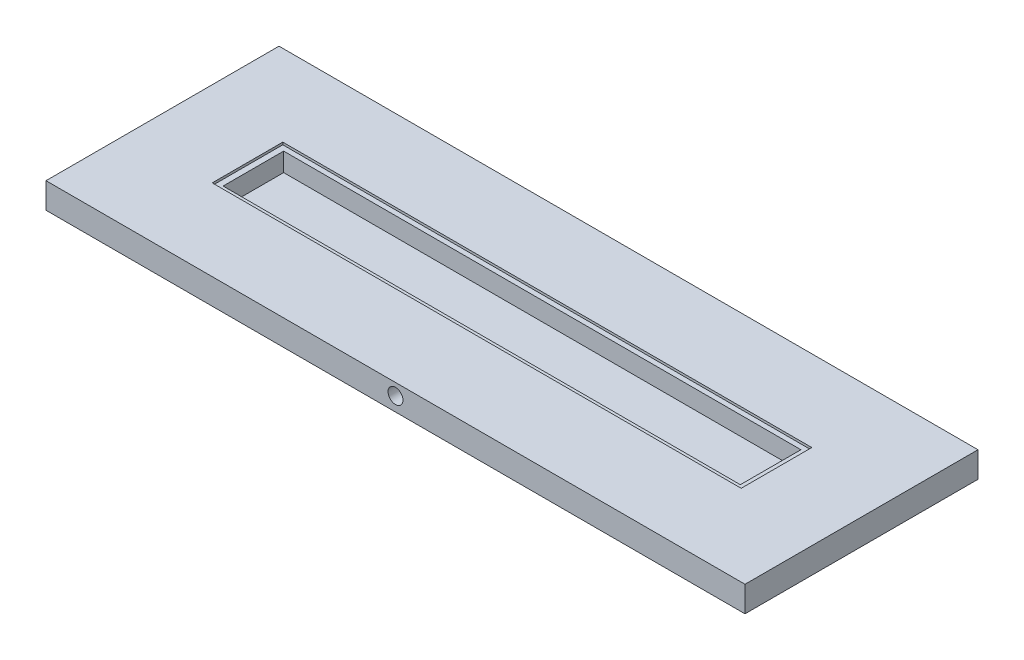
ISO-10303-21;
HEADER;
FILE_DESCRIPTION(('STEP AP214'),'2;1');
FILE_NAME('part.step','',(''),(''),'','','');
FILE_SCHEMA(('AUTOMOTIVE_DESIGN { 1 0 10303 214 1 1 1 1 }'));
ENDSEC;
DATA;
#1=APPLICATION_CONTEXT('core data for automotive mechanical design processes');
#2=APPLICATION_PROTOCOL_DEFINITION('international standard','automotive_design',2000,#1);
#3=PRODUCT_CONTEXT('',#1,'mechanical');
#4=PRODUCT('Part','Part','',(#3));
#5=PRODUCT_RELATED_PRODUCT_CATEGORY('part','',(#4));
#6=PRODUCT_DEFINITION_FORMATION('','',#4);
#7=PRODUCT_DEFINITION_CONTEXT('part definition',#1,'design');
#8=PRODUCT_DEFINITION('design','',#6,#7);
#9=PRODUCT_DEFINITION_SHAPE('','',#8);
#10=(LENGTH_UNIT() NAMED_UNIT(*) SI_UNIT(.MILLI.,.METRE.));
#11=(NAMED_UNIT(*) PLANE_ANGLE_UNIT() SI_UNIT($,.RADIAN.));
#12=(NAMED_UNIT(*) SI_UNIT($,.STERADIAN.) SOLID_ANGLE_UNIT());
#13=UNCERTAINTY_MEASURE_WITH_UNIT(LENGTH_MEASURE(1.E-05),#10,'distance_accuracy_value','');
#14=(GEOMETRIC_REPRESENTATION_CONTEXT(3) GLOBAL_UNCERTAINTY_ASSIGNED_CONTEXT((#13)) GLOBAL_UNIT_ASSIGNED_CONTEXT((#10,
#11,#12)) REPRESENTATION_CONTEXT('',''));
#15=CARTESIAN_POINT('',(0.,0.,0.));
#16=DIRECTION('',(0.,0.,1.));
#17=DIRECTION('',(1.,0.,0.));
#18=AXIS2_PLACEMENT_3D('',#15,#16,#17);
#19=CARTESIAN_POINT('',(0.,40.,0.));
#20=DIRECTION('',(0.,-1.,0.));
#21=DIRECTION('',(0.,0.,-1.));
#22=AXIS2_PLACEMENT_3D('',#19,#20,#21);
#23=PLANE('',#22);
#24=DIRECTION('',(-1.,0.,0.));
#25=VECTOR('',#24,1.);
#26=CARTESIAN_POINT('',(-567.58,40.,-75.76));
#27=LINE('',#26,#25);
#28=CARTESIAN_POINT('',(567.58,40.,-75.76));
#29=VERTEX_POINT('',#28);
#30=CARTESIAN_POINT('',(-567.58,40.,-75.76));
#31=VERTEX_POINT('',#30);
#32=EDGE_CURVE('E218',#29,#31,#27,.T.);
#33=ORIENTED_EDGE('',*,*,#32,.T.);
#34=DIRECTION('',(0.,0.,1.));
#35=VECTOR('',#34,1.);
#36=CARTESIAN_POINT('',(-567.58,40.,-75.76));
#37=LINE('',#36,#35);
#38=CARTESIAN_POINT('',(-567.58,40.,75.76));
#39=VERTEX_POINT('',#38);
#40=EDGE_CURVE('E221',#31,#39,#37,.T.);
#41=ORIENTED_EDGE('',*,*,#40,.T.);
#42=DIRECTION('',(1.,0.,0.));
#43=VECTOR('',#42,1.);
#44=CARTESIAN_POINT('',(-567.58,40.,75.76));
#45=LINE('',#44,#43);
#46=CARTESIAN_POINT('',(567.58,40.,75.7599999999999));
#47=VERTEX_POINT('',#46);
#48=EDGE_CURVE('E45',#39,#47,#45,.T.);
#49=ORIENTED_EDGE('',*,*,#48,.T.);
#50=DIRECTION('',(0.,0.,-1.));
#51=VECTOR('',#50,1.);
#52=CARTESIAN_POINT('',(567.58,40.,-75.76));
#53=LINE('',#52,#51);
#54=EDGE_CURVE('E12',#47,#29,#53,.T.);
#55=ORIENTED_EDGE('',*,*,#54,.T.);
#56=EDGE_LOOP('',(#33,#41,#49,#55));
#57=FACE_BOUND('',#56,.T.);
#58=DIRECTION('',(1.,0.,0.));
#59=VECTOR('',#58,1.);
#60=CARTESIAN_POINT('',(-555.,40.,65.));
#61=LINE('',#60,#59);
#62=CARTESIAN_POINT('',(-555.,40.,65.));
#63=VERTEX_POINT('',#62);
#64=CARTESIAN_POINT('',(555.,40.,65.));
#65=VERTEX_POINT('',#64);
#66=EDGE_CURVE('E193',#63,#65,#61,.T.);
#67=ORIENTED_EDGE('',*,*,#66,.F.);
#68=DIRECTION('',(0.,0.,1.));
#69=VECTOR('',#68,1.);
#70=CARTESIAN_POINT('',(-555.,40.,-65.));
#71=LINE('',#70,#69);
#72=CARTESIAN_POINT('',(-555.,40.,-65.));
#73=VERTEX_POINT('',#72);
#74=EDGE_CURVE('E200',#73,#63,#71,.T.);
#75=ORIENTED_EDGE('',*,*,#74,.F.);
#76=DIRECTION('',(-1.,0.,0.));
#77=VECTOR('',#76,1.);
#78=CARTESIAN_POINT('',(-555.,40.,-65.));
#79=LINE('',#78,#77);
#80=CARTESIAN_POINT('',(555.,40.,-65.));
#81=VERTEX_POINT('',#80);
#82=EDGE_CURVE('E198',#81,#73,#79,.T.);
#83=ORIENTED_EDGE('',*,*,#82,.F.);
#84=DIRECTION('',(0.,0.,-1.));
#85=VECTOR('',#84,1.);
#86=CARTESIAN_POINT('',(555.,40.,-65.));
#87=LINE('',#86,#85);
#88=EDGE_CURVE('E195',#65,#81,#87,.T.);
#89=ORIENTED_EDGE('',*,*,#88,.F.);
#90=EDGE_LOOP('',(#67,#75,#83,#89));
#91=FACE_BOUND('',#90,.T.);
#92=ADVANCED_FACE('F38',(#57,#91),#23,.F.);
#93=CARTESIAN_POINT('',(-555.,40.,65.));
#94=DIRECTION('',(0.,0.,-1.));
#95=DIRECTION('',(-1.,0.,0.));
#96=AXIS2_PLACEMENT_3D('',#93,#94,#95);
#97=PLANE('',#96);
#98=CARTESIAN_POINT('',(0.,20.,65.));
#99=DIRECTION('',(0.,0.,-1.));
#100=DIRECTION('',(-1.,0.,0.));
#101=AXIS2_PLACEMENT_3D('',#98,#99,#100);
#102=CIRCLE('',#101,16.);
#103=CARTESIAN_POINT('',(-16.,20.,65.));
#104=VERTEX_POINT('',#103);
#105=EDGE_CURVE('E149',#104,#104,#102,.F.);
#106=ORIENTED_EDGE('',*,*,#105,.T.);
#107=EDGE_LOOP('',(#106));
#108=FACE_BOUND('',#107,.T.);
#109=DIRECTION('',(1.,0.,0.));
#110=VECTOR('',#109,1.);
#111=CARTESIAN_POINT('',(-555.,0.,65.));
#112=LINE('',#111,#110);
#113=CARTESIAN_POINT('',(-555.,0.,65.));
#114=VERTEX_POINT('',#113);
#115=CARTESIAN_POINT('',(555.,0.,65.));
#116=VERTEX_POINT('',#115);
#117=EDGE_CURVE('E60',#114,#116,#112,.T.);
#118=ORIENTED_EDGE('',*,*,#117,.F.);
#119=DIRECTION('',(0.,-1.,0.));
#120=VECTOR('',#119,1.);
#121=CARTESIAN_POINT('',(-555.,40.,65.));
#122=LINE('',#121,#120);
#123=EDGE_CURVE('E202',#63,#114,#122,.T.);
#124=ORIENTED_EDGE('',*,*,#123,.F.);
#125=ORIENTED_EDGE('',*,*,#66,.T.);
#126=DIRECTION('',(0.,-1.,0.));
#127=VECTOR('',#126,1.);
#128=CARTESIAN_POINT('',(555.,40.,65.));
#129=LINE('',#128,#127);
#130=EDGE_CURVE('E216',#65,#116,#129,.T.);
#131=ORIENTED_EDGE('',*,*,#130,.T.);
#132=EDGE_LOOP('',(#118,#124,#125,#131));
#133=FACE_BOUND('',#132,.T.);
#134=ADVANCED_FACE('F257',(#108,#133),#97,.T.);
#135=CARTESIAN_POINT('',(555.,40.,-65.));
#136=DIRECTION('',(-1.,0.,0.));
#137=DIRECTION('',(0.,0.,1.));
#138=AXIS2_PLACEMENT_3D('',#135,#136,#137);
#139=PLANE('',#138);
#140=DIRECTION('',(0.,0.,-1.));
#141=VECTOR('',#140,1.);
#142=CARTESIAN_POINT('',(555.,0.,-65.));
#143=LINE('',#142,#141);
#144=CARTESIAN_POINT('',(555.,0.,-65.));
#145=VERTEX_POINT('',#144);
#146=EDGE_CURVE('E204',#116,#145,#143,.T.);
#147=ORIENTED_EDGE('',*,*,#146,.F.);
#148=ORIENTED_EDGE('',*,*,#130,.F.);
#149=ORIENTED_EDGE('',*,*,#88,.T.);
#150=DIRECTION('',(0.,-1.,0.));
#151=VECTOR('',#150,1.);
#152=CARTESIAN_POINT('',(555.,40.,-65.));
#153=LINE('',#152,#151);
#154=EDGE_CURVE('E214',#81,#145,#153,.T.);
#155=ORIENTED_EDGE('',*,*,#154,.T.);
#156=EDGE_LOOP('',(#147,#148,#149,#155));
#157=FACE_BOUND('',#156,.T.);
#158=ADVANCED_FACE('F261',(#157),#139,.T.);
#159=CARTESIAN_POINT('',(-555.,40.,-65.));
#160=DIRECTION('',(0.,0.,1.));
#161=DIRECTION('',(1.,0.,0.));
#162=AXIS2_PLACEMENT_3D('',#159,#160,#161);
#163=PLANE('',#162);
#164=DIRECTION('',(-1.,0.,0.));
#165=VECTOR('',#164,1.);
#166=CARTESIAN_POINT('',(-555.,0.,-65.));
#167=LINE('',#166,#165);
#168=CARTESIAN_POINT('',(-555.,0.,-65.));
#169=VERTEX_POINT('',#168);
#170=EDGE_CURVE('E207',#145,#169,#167,.T.);
#171=ORIENTED_EDGE('',*,*,#170,.F.);
#172=ORIENTED_EDGE('',*,*,#154,.F.);
#173=ORIENTED_EDGE('',*,*,#82,.T.);
#174=DIRECTION('',(0.,-1.,0.));
#175=VECTOR('',#174,1.);
#176=CARTESIAN_POINT('',(-555.,40.,-65.));
#177=LINE('',#176,#175);
#178=EDGE_CURVE('E52',#73,#169,#177,.T.);
#179=ORIENTED_EDGE('',*,*,#178,.T.);
#180=EDGE_LOOP('',(#171,#172,#173,#179));
#181=FACE_BOUND('',#180,.T.);
#182=ADVANCED_FACE('F266',(#181),#163,.T.);
#183=CARTESIAN_POINT('',(-555.,40.,-65.));
#184=DIRECTION('',(1.,0.,0.));
#185=DIRECTION('',(0.,0.,-1.));
#186=AXIS2_PLACEMENT_3D('',#183,#184,#185);
#187=PLANE('',#186);
#188=DIRECTION('',(0.,0.,1.));
#189=VECTOR('',#188,1.);
#190=CARTESIAN_POINT('',(-555.,0.,-65.));
#191=LINE('',#190,#189);
#192=EDGE_CURVE('E196',#169,#114,#191,.T.);
#193=ORIENTED_EDGE('',*,*,#192,.F.);
#194=ORIENTED_EDGE('',*,*,#178,.F.);
#195=ORIENTED_EDGE('',*,*,#74,.T.);
#196=ORIENTED_EDGE('',*,*,#123,.T.);
#197=EDGE_LOOP('',(#193,#194,#195,#196));
#198=FACE_BOUND('',#197,.T.);
#199=ADVANCED_FACE('F273',(#198),#187,.T.);
#200=CARTESIAN_POINT('',(0.,0.,0.));
#201=DIRECTION('',(0.,1.,0.));
#202=DIRECTION('',(0.,0.,1.));
#203=AXIS2_PLACEMENT_3D('',#200,#201,#202);
#204=PLANE('',#203);
#205=ORIENTED_EDGE('',*,*,#170,.T.);
#206=ORIENTED_EDGE('',*,*,#192,.T.);
#207=ORIENTED_EDGE('',*,*,#117,.T.);
#208=ORIENTED_EDGE('',*,*,#146,.T.);
#209=EDGE_LOOP('',(#205,#206,#207,#208));
#210=FACE_BOUND('',#209,.T.);
#211=ADVANCED_FACE('F277',(#210),#204,.T.);
#212=CARTESIAN_POINT('',(-567.58,1631.13883008419,-75.76));
#213=DIRECTION('',(1.,0.,0.));
#214=DIRECTION('',(0.,0.,-1.));
#215=AXIS2_PLACEMENT_3D('',#212,#213,#214);
#216=PLANE('',#215);
#217=ORIENTED_EDGE('',*,*,#40,.F.);
#218=DIRECTION('',(0.,-1.,0.));
#219=VECTOR('',#218,1.);
#220=CARTESIAN_POINT('',(-567.58,1631.13883008419,-75.76));
#221=LINE('',#220,#219);
#222=CARTESIAN_POINT('',(-567.58,44.9999999999999,-75.76));
#223=VERTEX_POINT('',#222);
#224=EDGE_CURVE('E183',#223,#31,#221,.T.);
#225=ORIENTED_EDGE('',*,*,#224,.F.);
#226=DIRECTION('',(0.,0.,-1.));
#227=VECTOR('',#226,1.);
#228=CARTESIAN_POINT('',(-567.58,44.9999999999999,-75.76));
#229=LINE('',#228,#227);
#230=CARTESIAN_POINT('',(-567.58,44.9999999999999,75.76));
#231=VERTEX_POINT('',#230);
#232=EDGE_CURVE('E168',#231,#223,#229,.T.);
#233=ORIENTED_EDGE('',*,*,#232,.F.);
#234=DIRECTION('',(0.,-1.,0.));
#235=VECTOR('',#234,1.);
#236=CARTESIAN_POINT('',(-567.58,1631.13883008419,75.76));
#237=LINE('',#236,#235);
#238=EDGE_CURVE('E173',#231,#39,#237,.T.);
#239=ORIENTED_EDGE('',*,*,#238,.T.);
#240=EDGE_LOOP('',(#217,#225,#233,#239));
#241=FACE_BOUND('',#240,.T.);
#242=ADVANCED_FACE('F234',(#241),#216,.T.);
#243=CARTESIAN_POINT('',(-567.58,1631.13883008419,75.76));
#244=DIRECTION('',(0.,0.,-1.));
#245=DIRECTION('',(-1.,0.,0.));
#246=AXIS2_PLACEMENT_3D('',#243,#244,#245);
#247=PLANE('',#246);
#248=ORIENTED_EDGE('',*,*,#48,.F.);
#249=ORIENTED_EDGE('',*,*,#238,.F.);
#250=DIRECTION('',(-1.,0.,0.));
#251=VECTOR('',#250,1.);
#252=CARTESIAN_POINT('',(-567.58,44.9999999999999,75.76));
#253=LINE('',#252,#251);
#254=CARTESIAN_POINT('',(567.58,44.9999999999999,75.7599999999999));
#255=VERTEX_POINT('',#254);
#256=EDGE_CURVE('E190',#255,#231,#253,.T.);
#257=ORIENTED_EDGE('',*,*,#256,.F.);
#258=DIRECTION('',(0.,-1.,0.));
#259=VECTOR('',#258,1.);
#260=CARTESIAN_POINT('',(567.58,1631.13883008419,75.7599999999999));
#261=LINE('',#260,#259);
#262=EDGE_CURVE('E177',#255,#47,#261,.T.);
#263=ORIENTED_EDGE('',*,*,#262,.T.);
#264=EDGE_LOOP('',(#248,#249,#257,#263));
#265=FACE_BOUND('',#264,.T.);
#266=ADVANCED_FACE('F229',(#265),#247,.T.);
#267=CARTESIAN_POINT('',(567.58,1631.13883008419,75.7599999999999));
#268=DIRECTION('',(-1.,0.,0.));
#269=DIRECTION('',(0.,0.,1.));
#270=AXIS2_PLACEMENT_3D('',#267,#268,#269);
#271=PLANE('',#270);
#272=ORIENTED_EDGE('',*,*,#54,.F.);
#273=ORIENTED_EDGE('',*,*,#262,.F.);
#274=DIRECTION('',(0.,0.,1.));
#275=VECTOR('',#274,1.);
#276=CARTESIAN_POINT('',(567.58,44.9999999999999,75.7599999999999));
#277=LINE('',#276,#275);
#278=CARTESIAN_POINT('',(567.58,44.9999999999999,-75.76));
#279=VERTEX_POINT('',#278);
#280=EDGE_CURVE('E167',#279,#255,#277,.T.);
#281=ORIENTED_EDGE('',*,*,#280,.F.);
#282=DIRECTION('',(0.,-1.,0.));
#283=VECTOR('',#282,1.);
#284=CARTESIAN_POINT('',(567.58,1631.13883008419,-75.76));
#285=LINE('',#284,#283);
#286=EDGE_CURVE('E180',#279,#29,#285,.T.);
#287=ORIENTED_EDGE('',*,*,#286,.T.);
#288=EDGE_LOOP('',(#272,#273,#281,#287));
#289=FACE_BOUND('',#288,.T.);
#290=ADVANCED_FACE('F242',(#289),#271,.T.);
#291=CARTESIAN_POINT('',(567.58,1631.13883008419,-75.76));
#292=DIRECTION('',(0.,0.,1.));
#293=DIRECTION('',(1.,0.,0.));
#294=AXIS2_PLACEMENT_3D('',#291,#292,#293);
#295=PLANE('',#294);
#296=ORIENTED_EDGE('',*,*,#32,.F.);
#297=ORIENTED_EDGE('',*,*,#286,.F.);
#298=DIRECTION('',(1.,0.,0.));
#299=VECTOR('',#298,1.);
#300=CARTESIAN_POINT('',(567.58,44.9999999999999,-75.76));
#301=LINE('',#300,#299);
#302=EDGE_CURVE('E165',#223,#279,#301,.T.);
#303=ORIENTED_EDGE('',*,*,#302,.F.);
#304=ORIENTED_EDGE('',*,*,#224,.T.);
#305=EDGE_LOOP('',(#296,#297,#303,#304));
#306=FACE_BOUND('',#305,.T.);
#307=ADVANCED_FACE('F245',(#306),#295,.T.);
#308=CARTESIAN_POINT('',(-750.,1631.13883008419,-250.));
#309=DIRECTION('',(1.,0.,0.));
#310=DIRECTION('',(0.,0.,-1.));
#311=AXIS2_PLACEMENT_3D('',#308,#309,#310);
#312=PLANE('',#311);
#313=DIRECTION('',(0.,-1.,0.));
#314=VECTOR('',#313,1.);
#315=CARTESIAN_POINT('',(-750.,1631.13883008419,250.));
#316=LINE('',#315,#314);
#317=CARTESIAN_POINT('',(-750.,44.9999999999999,250.));
#318=VERTEX_POINT('',#317);
#319=CARTESIAN_POINT('',(-750.,-10.,250.));
#320=VERTEX_POINT('',#319);
#321=EDGE_CURVE('E153',#318,#320,#316,.T.);
#322=ORIENTED_EDGE('',*,*,#321,.F.);
#323=DIRECTION('',(0.,0.,-1.));
#324=VECTOR('',#323,1.);
#325=CARTESIAN_POINT('',(-750.,44.9999999999999,-250.));
#326=LINE('',#325,#324);
#327=CARTESIAN_POINT('',(-750.,44.9999999999999,-250.));
#328=VERTEX_POINT('',#327);
#329=EDGE_CURVE('E154',#318,#328,#326,.T.);
#330=ORIENTED_EDGE('',*,*,#329,.T.);
#331=DIRECTION('',(0.,-1.,0.));
#332=VECTOR('',#331,1.);
#333=CARTESIAN_POINT('',(-750.,1631.13883008419,-250.));
#334=LINE('',#333,#332);
#335=CARTESIAN_POINT('',(-750.,-10.,-250.));
#336=VERTEX_POINT('',#335);
#337=EDGE_CURVE('E158',#328,#336,#334,.T.);
#338=ORIENTED_EDGE('',*,*,#337,.T.);
#339=DIRECTION('',(0.,0.,-1.));
#340=VECTOR('',#339,1.);
#341=CARTESIAN_POINT('',(-750.,-10.,-250.));
#342=LINE('',#341,#340);
#343=EDGE_CURVE('E155',#320,#336,#342,.T.);
#344=ORIENTED_EDGE('',*,*,#343,.F.);
#345=EDGE_LOOP('',(#322,#330,#338,#344));
#346=FACE_BOUND('',#345,.T.);
#347=ADVANCED_FACE('F247',(#346),#312,.F.);
#348=CARTESIAN_POINT('',(-750.,1631.13883008419,250.));
#349=DIRECTION('',(0.,0.,-1.));
#350=DIRECTION('',(-1.,0.,0.));
#351=AXIS2_PLACEMENT_3D('',#348,#349,#350);
#352=PLANE('',#351);
#353=CARTESIAN_POINT('',(0.,20.,250.));
#354=DIRECTION('',(0.,0.,1.));
#355=DIRECTION('',(1.,0.,0.));
#356=AXIS2_PLACEMENT_3D('',#353,#354,#355);
#357=CIRCLE('',#356,16.);
#358=CARTESIAN_POINT('',(16.,20.,250.));
#359=VERTEX_POINT('',#358);
#360=EDGE_CURVE('E438',#359,#359,#357,.T.);
#361=ORIENTED_EDGE('',*,*,#360,.F.);
#362=EDGE_LOOP('',(#361));
#363=FACE_BOUND('',#362,.T.);
#364=DIRECTION('',(0.,-1.,0.));
#365=VECTOR('',#364,1.);
#366=CARTESIAN_POINT('',(750.,1631.13883008419,250.));
#367=LINE('',#366,#365);
#368=CARTESIAN_POINT('',(750.,44.9999999999999,250.));
#369=VERTEX_POINT('',#368);
#370=CARTESIAN_POINT('',(750.,-10.,250.));
#371=VERTEX_POINT('',#370);
#372=EDGE_CURVE('E129',#369,#371,#367,.T.);
#373=ORIENTED_EDGE('',*,*,#372,.F.);
#374=DIRECTION('',(-1.,0.,0.));
#375=VECTOR('',#374,1.);
#376=CARTESIAN_POINT('',(-750.,44.9999999999999,250.));
#377=LINE('',#376,#375);
#378=EDGE_CURVE('E169',#369,#318,#377,.T.);
#379=ORIENTED_EDGE('',*,*,#378,.T.);
#380=ORIENTED_EDGE('',*,*,#321,.T.);
#381=DIRECTION('',(-1.,0.,0.));
#382=VECTOR('',#381,1.);
#383=CARTESIAN_POINT('',(-750.,-10.,250.));
#384=LINE('',#383,#382);
#385=EDGE_CURVE('E145',#371,#320,#384,.T.);
#386=ORIENTED_EDGE('',*,*,#385,.F.);
#387=EDGE_LOOP('',(#373,#379,#380,#386));
#388=FACE_BOUND('',#387,.T.);
#389=ADVANCED_FACE('F151',(#363,#388),#352,.F.);
#390=CARTESIAN_POINT('',(750.,1631.13883008419,-250.));
#391=DIRECTION('',(-1.,0.,0.));
#392=DIRECTION('',(0.,0.,1.));
#393=AXIS2_PLACEMENT_3D('',#390,#391,#392);
#394=PLANE('',#393);
#395=DIRECTION('',(0.,-1.,0.));
#396=VECTOR('',#395,1.);
#397=CARTESIAN_POINT('',(750.,1631.13883008419,-250.));
#398=LINE('',#397,#396);
#399=CARTESIAN_POINT('',(750.,44.9999999999999,-250.));
#400=VERTEX_POINT('',#399);
#401=CARTESIAN_POINT('',(750.,-10.,-250.));
#402=VERTEX_POINT('',#401);
#403=EDGE_CURVE('E171',#400,#402,#398,.T.);
#404=ORIENTED_EDGE('',*,*,#403,.F.);
#405=DIRECTION('',(0.,0.,1.));
#406=VECTOR('',#405,1.);
#407=CARTESIAN_POINT('',(750.,44.9999999999999,-250.));
#408=LINE('',#407,#406);
#409=EDGE_CURVE('E134',#400,#369,#408,.T.);
#410=ORIENTED_EDGE('',*,*,#409,.T.);
#411=ORIENTED_EDGE('',*,*,#372,.T.);
#412=DIRECTION('',(0.,0.,1.));
#413=VECTOR('',#412,1.);
#414=CARTESIAN_POINT('',(750.,-10.,-250.));
#415=LINE('',#414,#413);
#416=EDGE_CURVE('E133',#402,#371,#415,.T.);
#417=ORIENTED_EDGE('',*,*,#416,.F.);
#418=EDGE_LOOP('',(#404,#410,#411,#417));
#419=FACE_BOUND('',#418,.T.);
#420=ADVANCED_FACE('F132',(#419),#394,.F.);
#421=CARTESIAN_POINT('',(-750.,1631.13883008419,-250.));
#422=DIRECTION('',(0.,0.,1.));
#423=DIRECTION('',(1.,0.,0.));
#424=AXIS2_PLACEMENT_3D('',#421,#422,#423);
#425=PLANE('',#424);
#426=ORIENTED_EDGE('',*,*,#337,.F.);
#427=DIRECTION('',(1.,0.,0.));
#428=VECTOR('',#427,1.);
#429=CARTESIAN_POINT('',(-750.,44.9999999999999,-250.));
#430=LINE('',#429,#428);
#431=EDGE_CURVE('E138',#328,#400,#430,.T.);
#432=ORIENTED_EDGE('',*,*,#431,.T.);
#433=ORIENTED_EDGE('',*,*,#403,.T.);
#434=DIRECTION('',(1.,0.,0.));
#435=VECTOR('',#434,1.);
#436=CARTESIAN_POINT('',(-750.,-10.,-250.));
#437=LINE('',#436,#435);
#438=EDGE_CURVE('E148',#336,#402,#437,.T.);
#439=ORIENTED_EDGE('',*,*,#438,.F.);
#440=EDGE_LOOP('',(#426,#432,#433,#439));
#441=FACE_BOUND('',#440,.T.);
#442=ADVANCED_FACE('F286',(#441),#425,.F.);
#443=CARTESIAN_POINT('',(0.,45.,0.));
#444=DIRECTION('',(0.,-1.,0.));
#445=DIRECTION('',(0.,0.,-1.));
#446=AXIS2_PLACEMENT_3D('',#443,#444,#445);
#447=PLANE('',#446);
#448=ORIENTED_EDGE('',*,*,#232,.T.);
#449=ORIENTED_EDGE('',*,*,#302,.T.);
#450=ORIENTED_EDGE('',*,*,#280,.T.);
#451=ORIENTED_EDGE('',*,*,#256,.T.);
#452=EDGE_LOOP('',(#448,#449,#450,#451));
#453=FACE_BOUND('',#452,.T.);
#454=ORIENTED_EDGE('',*,*,#378,.F.);
#455=ORIENTED_EDGE('',*,*,#409,.F.);
#456=ORIENTED_EDGE('',*,*,#431,.F.);
#457=ORIENTED_EDGE('',*,*,#329,.F.);
#458=EDGE_LOOP('',(#454,#455,#456,#457));
#459=FACE_BOUND('',#458,.T.);
#460=ADVANCED_FACE('F238',(#453,#459),#447,.F.);
#461=CARTESIAN_POINT('',(0.,-10.,0.));
#462=DIRECTION('',(0.,1.,0.));
#463=DIRECTION('',(0.,0.,1.));
#464=AXIS2_PLACEMENT_3D('',#461,#462,#463);
#465=PLANE('',#464);
#466=ORIENTED_EDGE('',*,*,#343,.T.);
#467=ORIENTED_EDGE('',*,*,#438,.T.);
#468=ORIENTED_EDGE('',*,*,#416,.T.);
#469=ORIENTED_EDGE('',*,*,#385,.T.);
#470=EDGE_LOOP('',(#466,#467,#468,#469));
#471=FACE_BOUND('',#470,.T.);
#472=ADVANCED_FACE('F144',(#471),#465,.F.);
#473=CARTESIAN_POINT('',(0.,20.,250.));
#474=DIRECTION('',(0.,0.,-1.));
#475=DIRECTION('',(-1.,0.,0.));
#476=AXIS2_PLACEMENT_3D('',#473,#474,#475);
#477=CYLINDRICAL_SURFACE('',#476,16.);
#478=ORIENTED_EDGE('',*,*,#105,.F.);
#479=EDGE_LOOP('',(#478));
#480=FACE_BOUND('',#479,.T.);
#481=ORIENTED_EDGE('',*,*,#360,.T.);
#482=EDGE_LOOP('',(#481));
#483=FACE_BOUND('',#482,.T.);
#484=ADVANCED_FACE('F283',(#480,#483),#477,.F.);
#485=CLOSED_SHELL('',(#92,#134,#158,#182,#199,#211,#242,#266,#290,#307,#347,#389,#420,#442,#460,
#472,#484));
#486=MANIFOLD_SOLID_BREP('B2',#485);
#487=ADVANCED_BREP_SHAPE_REPRESENTATION('',(#18,#486),#14);
#488=SHAPE_DEFINITION_REPRESENTATION(#9,#487);
ENDSEC;
END-ISO-10303-21;
